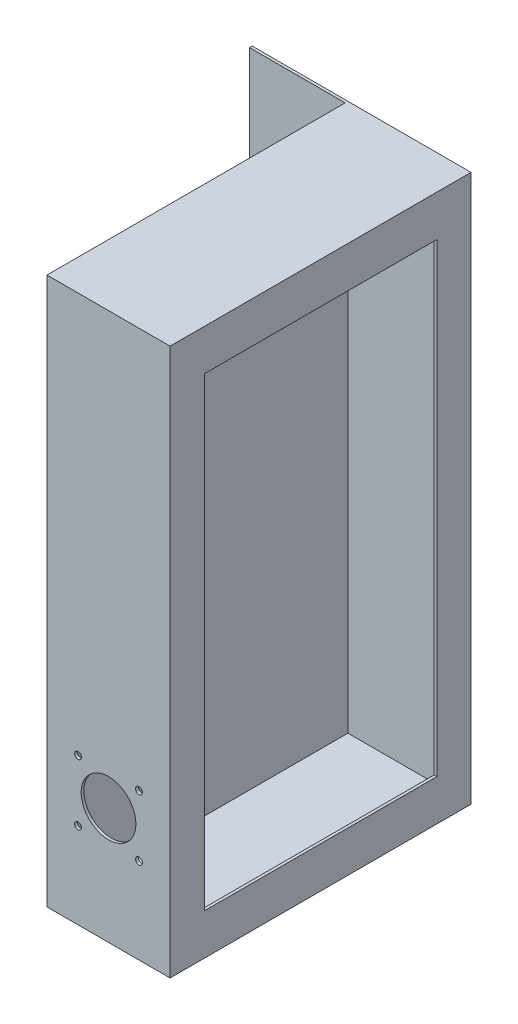
ISO-10303-21;
HEADER;
FILE_DESCRIPTION(('STEP AP214'),'2;1');
FILE_NAME('part.step','',(''),(''),'','','');
FILE_SCHEMA(('AUTOMOTIVE_DESIGN { 1 0 10303 214 1 1 1 1 }'));
ENDSEC;
DATA;
#1=APPLICATION_CONTEXT('core data for automotive mechanical design processes');
#2=APPLICATION_PROTOCOL_DEFINITION('international standard','automotive_design',2000,#1);
#3=PRODUCT_CONTEXT('',#1,'mechanical');
#4=PRODUCT('Part','Part','',(#3));
#5=PRODUCT_RELATED_PRODUCT_CATEGORY('part','',(#4));
#6=PRODUCT_DEFINITION_FORMATION('','',#4);
#7=PRODUCT_DEFINITION_CONTEXT('part definition',#1,'design');
#8=PRODUCT_DEFINITION('design','',#6,#7);
#9=PRODUCT_DEFINITION_SHAPE('','',#8);
#10=(LENGTH_UNIT() NAMED_UNIT(*) SI_UNIT(.MILLI.,.METRE.));
#11=(NAMED_UNIT(*) PLANE_ANGLE_UNIT() SI_UNIT($,.RADIAN.));
#12=(NAMED_UNIT(*) SI_UNIT($,.STERADIAN.) SOLID_ANGLE_UNIT());
#13=UNCERTAINTY_MEASURE_WITH_UNIT(LENGTH_MEASURE(1.E-05),#10,'distance_accuracy_value','');
#14=(GEOMETRIC_REPRESENTATION_CONTEXT(3) GLOBAL_UNCERTAINTY_ASSIGNED_CONTEXT((#13)) GLOBAL_UNIT_ASSIGNED_CONTEXT((#10,
#11,#12)) REPRESENTATION_CONTEXT('',''));
#15=CARTESIAN_POINT('',(0.,0.,0.));
#16=DIRECTION('',(0.,0.,1.));
#17=DIRECTION('',(1.,0.,0.));
#18=AXIS2_PLACEMENT_3D('',#15,#16,#17);
#19=CARTESIAN_POINT('',(45.,200.,110.));
#20=DIRECTION('',(-1.,0.,0.));
#21=DIRECTION('',(0.,-1.,0.));
#22=AXIS2_PLACEMENT_3D('',#19,#20,#21);
#23=PLANE('',#22);
#24=DIRECTION('',(0.,0.,1.));
#25=VECTOR('',#24,1.);
#26=CARTESIAN_POINT('',(45.,170.,85.));
#27=LINE('',#26,#25);
#28=CARTESIAN_POINT('',(45.,170.,-85.));
#29=VERTEX_POINT('',#28);
#30=CARTESIAN_POINT('',(45.,170.,85.));
#31=VERTEX_POINT('',#30);
#32=EDGE_CURVE('E232',#29,#31,#27,.T.);
#33=ORIENTED_EDGE('',*,*,#32,.F.);
#34=DIRECTION('',(0.,1.,0.));
#35=VECTOR('',#34,1.);
#36=CARTESIAN_POINT('',(45.,170.,-85.));
#37=LINE('',#36,#35);
#38=CARTESIAN_POINT('',(45.,-170.,-85.));
#39=VERTEX_POINT('',#38);
#40=EDGE_CURVE('E235',#39,#29,#37,.T.);
#41=ORIENTED_EDGE('',*,*,#40,.F.);
#42=DIRECTION('',(0.,0.,-1.));
#43=VECTOR('',#42,1.);
#44=CARTESIAN_POINT('',(45.,-170.,85.));
#45=LINE('',#44,#43);
#46=CARTESIAN_POINT('',(45.,-170.,85.));
#47=VERTEX_POINT('',#46);
#48=EDGE_CURVE('E223',#47,#39,#45,.T.);
#49=ORIENTED_EDGE('',*,*,#48,.F.);
#50=DIRECTION('',(0.,-1.,0.));
#51=VECTOR('',#50,1.);
#52=CARTESIAN_POINT('',(45.,170.,85.));
#53=LINE('',#52,#51);
#54=EDGE_CURVE('E228',#31,#47,#53,.T.);
#55=ORIENTED_EDGE('',*,*,#54,.F.);
#56=EDGE_LOOP('',(#33,#41,#49,#55));
#57=FACE_BOUND('',#56,.T.);
#58=DIRECTION('',(0.,1.,0.));
#59=VECTOR('',#58,1.);
#60=CARTESIAN_POINT('',(45.,200.,-110.));
#61=LINE('',#60,#59);
#62=CARTESIAN_POINT('',(45.,-200.,-110.));
#63=VERTEX_POINT('',#62);
#64=CARTESIAN_POINT('',(45.,200.,-110.));
#65=VERTEX_POINT('',#64);
#66=EDGE_CURVE('E227',#63,#65,#61,.T.);
#67=ORIENTED_EDGE('',*,*,#66,.T.);
#68=DIRECTION('',(0.,0.,-1.));
#69=VECTOR('',#68,1.);
#70=CARTESIAN_POINT('',(45.,200.,110.));
#71=LINE('',#70,#69);
#72=CARTESIAN_POINT('',(45.,200.,110.));
#73=VERTEX_POINT('',#72);
#74=EDGE_CURVE('E292',#73,#65,#71,.T.);
#75=ORIENTED_EDGE('',*,*,#74,.F.);
#76=DIRECTION('',(0.,1.,0.));
#77=VECTOR('',#76,1.);
#78=CARTESIAN_POINT('',(45.,200.,110.));
#79=LINE('',#78,#77);
#80=CARTESIAN_POINT('',(45.,-200.,110.));
#81=VERTEX_POINT('',#80);
#82=EDGE_CURVE('E260',#81,#73,#79,.T.);
#83=ORIENTED_EDGE('',*,*,#82,.F.);
#84=DIRECTION('',(0.,0.,-1.));
#85=VECTOR('',#84,1.);
#86=CARTESIAN_POINT('',(45.,-200.,110.));
#87=LINE('',#86,#85);
#88=EDGE_CURVE('E274',#81,#63,#87,.T.);
#89=ORIENTED_EDGE('',*,*,#88,.T.);
#90=EDGE_LOOP('',(#67,#75,#83,#89));
#91=FACE_BOUND('',#90,.T.);
#92=ADVANCED_FACE('F39',(#57,#91),#23,.F.);
#93=CARTESIAN_POINT('',(-45.,200.,110.));
#94=DIRECTION('',(0.,-1.,0.));
#95=DIRECTION('',(0.,0.,-1.));
#96=AXIS2_PLACEMENT_3D('',#93,#94,#95);
#97=PLANE('',#96);
#98=DIRECTION('',(-1.,0.,0.));
#99=VECTOR('',#98,1.);
#100=CARTESIAN_POINT('',(-45.,200.,-110.));
#101=LINE('',#100,#99);
#102=CARTESIAN_POINT('',(-115.,200.,-110.));
#103=VERTEX_POINT('',#102);
#104=EDGE_CURVE('E278',#65,#103,#101,.T.);
#105=ORIENTED_EDGE('',*,*,#104,.T.);
#106=DIRECTION('',(0.,0.,-1.));
#107=VECTOR('',#106,1.);
#108=CARTESIAN_POINT('',(-115.,200.,-108.));
#109=LINE('',#108,#107);
#110=CARTESIAN_POINT('',(-115.,200.,-108.));
#111=VERTEX_POINT('',#110);
#112=EDGE_CURVE('E153',#111,#103,#109,.T.);
#113=ORIENTED_EDGE('',*,*,#112,.F.);
#114=DIRECTION('',(1.,0.,0.));
#115=VECTOR('',#114,1.);
#116=CARTESIAN_POINT('',(-45.,200.,-108.));
#117=LINE('',#116,#115);
#118=CARTESIAN_POINT('',(-45.,200.,-108.));
#119=VERTEX_POINT('',#118);
#120=EDGE_CURVE('E154',#111,#119,#117,.T.);
#121=ORIENTED_EDGE('',*,*,#120,.T.);
#122=DIRECTION('',(0.,0.,-1.));
#123=VECTOR('',#122,1.);
#124=CARTESIAN_POINT('',(-45.,200.,110.));
#125=LINE('',#124,#123);
#126=CARTESIAN_POINT('',(-45.,200.,110.));
#127=VERTEX_POINT('',#126);
#128=EDGE_CURVE('E288',#127,#119,#125,.T.);
#129=ORIENTED_EDGE('',*,*,#128,.F.);
#130=DIRECTION('',(-1.,0.,0.));
#131=VECTOR('',#130,1.);
#132=CARTESIAN_POINT('',(-45.,200.,110.));
#133=LINE('',#132,#131);
#134=EDGE_CURVE('E264',#73,#127,#133,.T.);
#135=ORIENTED_EDGE('',*,*,#134,.F.);
#136=ORIENTED_EDGE('',*,*,#74,.T.);
#137=EDGE_LOOP('',(#105,#113,#121,#129,#135,#136));
#138=FACE_BOUND('',#137,.T.);
#139=ADVANCED_FACE('F361',(#138),#97,.F.);
#140=CARTESIAN_POINT('',(-45.,200.,110.));
#141=DIRECTION('',(1.,0.,0.));
#142=DIRECTION('',(0.,1.,0.));
#143=AXIS2_PLACEMENT_3D('',#140,#141,#142);
#144=PLANE('',#143);
#145=ORIENTED_EDGE('',*,*,#128,.T.);
#146=DIRECTION('',(0.,-1.,0.));
#147=VECTOR('',#146,1.);
#148=CARTESIAN_POINT('',(-45.,200.,-108.));
#149=LINE('',#148,#147);
#150=CARTESIAN_POINT('',(-45.,-200.,-108.));
#151=VERTEX_POINT('',#150);
#152=EDGE_CURVE('E166',#119,#151,#149,.T.);
#153=ORIENTED_EDGE('',*,*,#152,.T.);
#154=DIRECTION('',(0.,0.,-1.));
#155=VECTOR('',#154,1.);
#156=CARTESIAN_POINT('',(-45.,-200.,110.));
#157=LINE('',#156,#155);
#158=CARTESIAN_POINT('',(-45.,-200.,110.));
#159=VERTEX_POINT('',#158);
#160=EDGE_CURVE('E164',#159,#151,#157,.T.);
#161=ORIENTED_EDGE('',*,*,#160,.F.);
#162=DIRECTION('',(0.,-1.,0.));
#163=VECTOR('',#162,1.);
#164=CARTESIAN_POINT('',(-45.,200.,110.));
#165=LINE('',#164,#163);
#166=EDGE_CURVE('E268',#127,#159,#165,.T.);
#167=ORIENTED_EDGE('',*,*,#166,.F.);
#168=EDGE_LOOP('',(#145,#153,#161,#167));
#169=FACE_BOUND('',#168,.T.);
#170=ADVANCED_FACE('F368',(#169),#144,.F.);
#171=CARTESIAN_POINT('',(-45.,-200.,110.));
#172=DIRECTION('',(0.,1.,0.));
#173=DIRECTION('',(0.,0.,1.));
#174=AXIS2_PLACEMENT_3D('',#171,#172,#173);
#175=PLANE('',#174);
#176=DIRECTION('',(1.,0.,0.));
#177=VECTOR('',#176,1.);
#178=CARTESIAN_POINT('',(-45.,-200.,-110.));
#179=LINE('',#178,#177);
#180=CARTESIAN_POINT('',(-115.,-200.,-110.));
#181=VERTEX_POINT('',#180);
#182=EDGE_CURVE('E265',#181,#63,#179,.T.);
#183=ORIENTED_EDGE('',*,*,#182,.T.);
#184=ORIENTED_EDGE('',*,*,#88,.F.);
#185=DIRECTION('',(1.,0.,0.));
#186=VECTOR('',#185,1.);
#187=CARTESIAN_POINT('',(-45.,-200.,110.));
#188=LINE('',#187,#186);
#189=EDGE_CURVE('E271',#159,#81,#188,.T.);
#190=ORIENTED_EDGE('',*,*,#189,.F.);
#191=ORIENTED_EDGE('',*,*,#160,.T.);
#192=DIRECTION('',(-1.,0.,0.));
#193=VECTOR('',#192,1.);
#194=CARTESIAN_POINT('',(-45.0000000000001,-200.,-108.));
#195=LINE('',#194,#193);
#196=CARTESIAN_POINT('',(-115.,-200.,-108.));
#197=VERTEX_POINT('',#196);
#198=EDGE_CURVE('E57',#151,#197,#195,.T.);
#199=ORIENTED_EDGE('',*,*,#198,.T.);
#200=DIRECTION('',(0.,0.,-1.));
#201=VECTOR('',#200,1.);
#202=CARTESIAN_POINT('',(-115.,-200.,-108.));
#203=LINE('',#202,#201);
#204=EDGE_CURVE('E144',#197,#181,#203,.T.);
#205=ORIENTED_EDGE('',*,*,#204,.T.);
#206=EDGE_LOOP('',(#183,#184,#190,#191,#199,#205));
#207=FACE_BOUND('',#206,.T.);
#208=ADVANCED_FACE('F161',(#207),#175,.F.);
#209=CARTESIAN_POINT('',(0.,0.,110.));
#210=DIRECTION('',(0.,0.,1.));
#211=DIRECTION('',(1.,0.,0.));
#212=AXIS2_PLACEMENT_3D('',#209,#210,#211);
#213=PLANE('',#212);
#214=CARTESIAN_POINT('',(22.275,-137.275,110.));
#215=DIRECTION('',(0.,0.,1.));
#216=DIRECTION('',(1.,0.,0.));
#217=AXIS2_PLACEMENT_3D('',#214,#215,#216);
#218=CIRCLE('',#217,2.5);
#219=CARTESIAN_POINT('',(24.775,-137.275,110.));
#220=VERTEX_POINT('',#219);
#221=EDGE_CURVE('E176',#220,#220,#218,.T.);
#222=ORIENTED_EDGE('',*,*,#221,.F.);
#223=EDGE_LOOP('',(#222));
#224=FACE_BOUND('',#223,.T.);
#225=CARTESIAN_POINT('',(-22.275,-137.275,110.));
#226=DIRECTION('',(0.,0.,1.));
#227=DIRECTION('',(1.,0.,0.));
#228=AXIS2_PLACEMENT_3D('',#225,#226,#227);
#229=CIRCLE('',#228,2.5);
#230=CARTESIAN_POINT('',(-19.775,-137.275,110.));
#231=VERTEX_POINT('',#230);
#232=EDGE_CURVE('E196',#231,#231,#229,.T.);
#233=ORIENTED_EDGE('',*,*,#232,.F.);
#234=EDGE_LOOP('',(#233));
#235=FACE_BOUND('',#234,.T.);
#236=CARTESIAN_POINT('',(22.275,-92.725,110.));
#237=DIRECTION('',(0.,0.,1.));
#238=DIRECTION('',(1.,0.,0.));
#239=AXIS2_PLACEMENT_3D('',#236,#237,#238);
#240=CIRCLE('',#239,2.5);
#241=CARTESIAN_POINT('',(24.775,-92.725,110.));
#242=VERTEX_POINT('',#241);
#243=EDGE_CURVE('E188',#242,#242,#240,.T.);
#244=ORIENTED_EDGE('',*,*,#243,.F.);
#245=EDGE_LOOP('',(#244));
#246=FACE_BOUND('',#245,.T.);
#247=CARTESIAN_POINT('',(-22.275,-92.725,110.));
#248=DIRECTION('',(0.,0.,1.));
#249=DIRECTION('',(1.,0.,0.));
#250=AXIS2_PLACEMENT_3D('',#247,#248,#249);
#251=CIRCLE('',#250,2.5);
#252=CARTESIAN_POINT('',(-19.775,-92.725,110.));
#253=VERTEX_POINT('',#252);
#254=EDGE_CURVE('E178',#253,#253,#251,.T.);
#255=ORIENTED_EDGE('',*,*,#254,.F.);
#256=EDGE_LOOP('',(#255));
#257=FACE_BOUND('',#256,.T.);
#258=CARTESIAN_POINT('',(0.,-115.,110.));
#259=DIRECTION('',(0.,0.,1.));
#260=DIRECTION('',(1.,0.,0.));
#261=AXIS2_PLACEMENT_3D('',#258,#259,#260);
#262=CIRCLE('',#261,20.);
#263=CARTESIAN_POINT('',(20.,-115.,110.));
#264=VERTEX_POINT('',#263);
#265=EDGE_CURVE('E187',#264,#264,#262,.T.);
#266=ORIENTED_EDGE('',*,*,#265,.F.);
#267=EDGE_LOOP('',(#266));
#268=FACE_BOUND('',#267,.T.);
#269=ORIENTED_EDGE('',*,*,#82,.T.);
#270=ORIENTED_EDGE('',*,*,#134,.T.);
#271=ORIENTED_EDGE('',*,*,#166,.T.);
#272=ORIENTED_EDGE('',*,*,#189,.T.);
#273=EDGE_LOOP('',(#269,#270,#271,#272));
#274=FACE_BOUND('',#273,.T.);
#275=ADVANCED_FACE('F456',(#224,#235,#246,#257,#268,#274),#213,.T.);
#276=CARTESIAN_POINT('',(0.,0.,-110.));
#277=DIRECTION('',(0.,0.,1.));
#278=DIRECTION('',(1.,0.,0.));
#279=AXIS2_PLACEMENT_3D('',#276,#277,#278);
#280=PLANE('',#279);
#281=ORIENTED_EDGE('',*,*,#66,.F.);
#282=ORIENTED_EDGE('',*,*,#182,.F.);
#283=DIRECTION('',(0.,1.,0.));
#284=VECTOR('',#283,1.);
#285=CARTESIAN_POINT('',(-115.,200.,-110.));
#286=LINE('',#285,#284);
#287=EDGE_CURVE('E150',#181,#103,#286,.T.);
#288=ORIENTED_EDGE('',*,*,#287,.T.);
#289=ORIENTED_EDGE('',*,*,#104,.F.);
#290=EDGE_LOOP('',(#281,#282,#288,#289));
#291=FACE_BOUND('',#290,.T.);
#292=ADVANCED_FACE('F419',(#291),#280,.F.);
#293=CARTESIAN_POINT('',(-45.0010000000001,170.,-85.));
#294=DIRECTION('',(0.,0.,-1.));
#295=DIRECTION('',(0.,1.,0.));
#296=AXIS2_PLACEMENT_3D('',#293,#294,#295);
#297=PLANE('',#296);
#298=DIRECTION('',(1.,0.,0.));
#299=VECTOR('',#298,1.);
#300=CARTESIAN_POINT('',(-45.001,-170.,-85.));
#301=LINE('',#300,#299);
#302=CARTESIAN_POINT('',(43.,-170.,-85.));
#303=VERTEX_POINT('',#302);
#304=EDGE_CURVE('E246',#303,#39,#301,.T.);
#305=ORIENTED_EDGE('',*,*,#304,.T.);
#306=ORIENTED_EDGE('',*,*,#40,.T.);
#307=DIRECTION('',(1.,0.,0.));
#308=VECTOR('',#307,1.);
#309=CARTESIAN_POINT('',(-45.0010000000001,170.,-85.));
#310=LINE('',#309,#308);
#311=CARTESIAN_POINT('',(43.,170.,-85.));
#312=VERTEX_POINT('',#311);
#313=EDGE_CURVE('E241',#312,#29,#310,.T.);
#314=ORIENTED_EDGE('',*,*,#313,.F.);
#315=DIRECTION('',(0.,1.,0.));
#316=VECTOR('',#315,1.);
#317=CARTESIAN_POINT('',(43.,170.,-85.));
#318=LINE('',#317,#316);
#319=EDGE_CURVE('E217',#303,#312,#318,.T.);
#320=ORIENTED_EDGE('',*,*,#319,.F.);
#321=EDGE_LOOP('',(#305,#306,#314,#320));
#322=FACE_BOUND('',#321,.T.);
#323=ADVANCED_FACE('F413',(#322),#297,.F.);
#324=CARTESIAN_POINT('',(-45.001,-170.,85.));
#325=DIRECTION('',(0.,-1.,0.));
#326=DIRECTION('',(1.,0.,0.));
#327=AXIS2_PLACEMENT_3D('',#324,#325,#326);
#328=PLANE('',#327);
#329=DIRECTION('',(1.,0.,0.));
#330=VECTOR('',#329,1.);
#331=CARTESIAN_POINT('',(-45.001,-170.,85.));
#332=LINE('',#331,#330);
#333=CARTESIAN_POINT('',(43.,-170.,85.));
#334=VERTEX_POINT('',#333);
#335=EDGE_CURVE('E222',#334,#47,#332,.T.);
#336=ORIENTED_EDGE('',*,*,#335,.T.);
#337=ORIENTED_EDGE('',*,*,#48,.T.);
#338=ORIENTED_EDGE('',*,*,#304,.F.);
#339=DIRECTION('',(0.,0.,-1.));
#340=VECTOR('',#339,1.);
#341=CARTESIAN_POINT('',(43.,-170.,85.));
#342=LINE('',#341,#340);
#343=EDGE_CURVE('E242',#334,#303,#342,.T.);
#344=ORIENTED_EDGE('',*,*,#343,.F.);
#345=EDGE_LOOP('',(#336,#337,#338,#344));
#346=FACE_BOUND('',#345,.T.);
#347=ADVANCED_FACE('F418',(#346),#328,.F.);
#348=CARTESIAN_POINT('',(-45.0010000000001,170.,85.));
#349=DIRECTION('',(0.,0.,1.));
#350=DIRECTION('',(0.,-1.,0.));
#351=AXIS2_PLACEMENT_3D('',#348,#349,#350);
#352=PLANE('',#351);
#353=DIRECTION('',(1.,0.,0.));
#354=VECTOR('',#353,1.);
#355=CARTESIAN_POINT('',(-45.0010000000001,170.,85.));
#356=LINE('',#355,#354);
#357=CARTESIAN_POINT('',(43.,170.,85.));
#358=VERTEX_POINT('',#357);
#359=EDGE_CURVE('E65',#358,#31,#356,.T.);
#360=ORIENTED_EDGE('',*,*,#359,.T.);
#361=ORIENTED_EDGE('',*,*,#54,.T.);
#362=ORIENTED_EDGE('',*,*,#335,.F.);
#363=DIRECTION('',(0.,-1.,0.));
#364=VECTOR('',#363,1.);
#365=CARTESIAN_POINT('',(43.,170.,85.));
#366=LINE('',#365,#364);
#367=EDGE_CURVE('E247',#358,#334,#366,.T.);
#368=ORIENTED_EDGE('',*,*,#367,.F.);
#369=EDGE_LOOP('',(#360,#361,#362,#368));
#370=FACE_BOUND('',#369,.T.);
#371=ADVANCED_FACE('F430',(#370),#352,.F.);
#372=CARTESIAN_POINT('',(-45.0010000000001,170.,85.));
#373=DIRECTION('',(0.,1.,0.));
#374=DIRECTION('',(-1.,0.,0.));
#375=AXIS2_PLACEMENT_3D('',#372,#373,#374);
#376=PLANE('',#375);
#377=ORIENTED_EDGE('',*,*,#313,.T.);
#378=ORIENTED_EDGE('',*,*,#32,.T.);
#379=ORIENTED_EDGE('',*,*,#359,.F.);
#380=DIRECTION('',(0.,0.,1.));
#381=VECTOR('',#380,1.);
#382=CARTESIAN_POINT('',(43.,170.,85.));
#383=LINE('',#382,#381);
#384=EDGE_CURVE('E218',#312,#358,#383,.T.);
#385=ORIENTED_EDGE('',*,*,#384,.F.);
#386=EDGE_LOOP('',(#377,#378,#379,#385));
#387=FACE_BOUND('',#386,.T.);
#388=ADVANCED_FACE('F377',(#387),#376,.F.);
#389=CARTESIAN_POINT('',(43.,200.,110.));
#390=DIRECTION('',(-1.,0.,0.));
#391=DIRECTION('',(0.,-1.,0.));
#392=AXIS2_PLACEMENT_3D('',#389,#390,#391);
#393=PLANE('',#392);
#394=DIRECTION('',(0.,1.,0.));
#395=VECTOR('',#394,1.);
#396=CARTESIAN_POINT('',(43.,200.,-108.));
#397=LINE('',#396,#395);
#398=CARTESIAN_POINT('',(43.,-198.,-108.));
#399=VERTEX_POINT('',#398);
#400=CARTESIAN_POINT('',(43.,198.,-108.));
#401=VERTEX_POINT('',#400);
#402=EDGE_CURVE('E43',#399,#401,#397,.T.);
#403=ORIENTED_EDGE('',*,*,#402,.F.);
#404=DIRECTION('',(0.,0.,-1.));
#405=VECTOR('',#404,1.);
#406=CARTESIAN_POINT('',(43.,-198.,110.));
#407=LINE('',#406,#405);
#408=CARTESIAN_POINT('',(43.,-198.,108.));
#409=VERTEX_POINT('',#408);
#410=EDGE_CURVE('E325',#409,#399,#407,.T.);
#411=ORIENTED_EDGE('',*,*,#410,.F.);
#412=DIRECTION('',(0.,1.,0.));
#413=VECTOR('',#412,1.);
#414=CARTESIAN_POINT('',(43.,200.,108.));
#415=LINE('',#414,#413);
#416=CARTESIAN_POINT('',(43.,198.,108.));
#417=VERTEX_POINT('',#416);
#418=EDGE_CURVE('E301',#409,#417,#415,.T.);
#419=ORIENTED_EDGE('',*,*,#418,.T.);
#420=DIRECTION('',(0.,0.,-1.));
#421=VECTOR('',#420,1.);
#422=CARTESIAN_POINT('',(43.,198.,110.));
#423=LINE('',#422,#421);
#424=EDGE_CURVE('E319',#417,#401,#423,.T.);
#425=ORIENTED_EDGE('',*,*,#424,.T.);
#426=EDGE_LOOP('',(#403,#411,#419,#425));
#427=FACE_BOUND('',#426,.T.);
#428=ORIENTED_EDGE('',*,*,#343,.T.);
#429=ORIENTED_EDGE('',*,*,#319,.T.);
#430=ORIENTED_EDGE('',*,*,#384,.T.);
#431=ORIENTED_EDGE('',*,*,#367,.T.);
#432=EDGE_LOOP('',(#428,#429,#430,#431));
#433=FACE_BOUND('',#432,.T.);
#434=ADVANCED_FACE('F336',(#427,#433),#393,.T.);
#435=CARTESIAN_POINT('',(-45.,198.,110.));
#436=DIRECTION('',(0.,-1.,0.));
#437=DIRECTION('',(0.,0.,-1.));
#438=AXIS2_PLACEMENT_3D('',#435,#436,#437);
#439=PLANE('',#438);
#440=DIRECTION('',(-1.,0.,0.));
#441=VECTOR('',#440,1.);
#442=CARTESIAN_POINT('',(-45.,198.,-108.));
#443=LINE('',#442,#441);
#444=CARTESIAN_POINT('',(-43.,198.,-108.));
#445=VERTEX_POINT('',#444);
#446=EDGE_CURVE('E323',#401,#445,#443,.T.);
#447=ORIENTED_EDGE('',*,*,#446,.F.);
#448=ORIENTED_EDGE('',*,*,#424,.F.);
#449=DIRECTION('',(-1.,0.,0.));
#450=VECTOR('',#449,1.);
#451=CARTESIAN_POINT('',(-45.,198.,108.));
#452=LINE('',#451,#450);
#453=CARTESIAN_POINT('',(-43.,198.,108.));
#454=VERTEX_POINT('',#453);
#455=EDGE_CURVE('E298',#417,#454,#452,.T.);
#456=ORIENTED_EDGE('',*,*,#455,.T.);
#457=DIRECTION('',(0.,0.,-1.));
#458=VECTOR('',#457,1.);
#459=CARTESIAN_POINT('',(-43.,198.,110.));
#460=LINE('',#459,#458);
#461=EDGE_CURVE('E312',#454,#445,#460,.T.);
#462=ORIENTED_EDGE('',*,*,#461,.T.);
#463=EDGE_LOOP('',(#447,#448,#456,#462));
#464=FACE_BOUND('',#463,.T.);
#465=ADVANCED_FACE('F341',(#464),#439,.T.);
#466=CARTESIAN_POINT('',(-43.,200.,110.));
#467=DIRECTION('',(1.,0.,0.));
#468=DIRECTION('',(0.,1.,0.));
#469=AXIS2_PLACEMENT_3D('',#466,#467,#468);
#470=PLANE('',#469);
#471=DIRECTION('',(0.,-1.,0.));
#472=VECTOR('',#471,1.);
#473=CARTESIAN_POINT('',(-43.,200.,-108.));
#474=LINE('',#473,#472);
#475=CARTESIAN_POINT('',(-43.,-198.,-108.));
#476=VERTEX_POINT('',#475);
#477=EDGE_CURVE('E316',#445,#476,#474,.T.);
#478=ORIENTED_EDGE('',*,*,#477,.F.);
#479=ORIENTED_EDGE('',*,*,#461,.F.);
#480=DIRECTION('',(0.,-1.,0.));
#481=VECTOR('',#480,1.);
#482=CARTESIAN_POINT('',(-43.,200.,108.));
#483=LINE('',#482,#481);
#484=CARTESIAN_POINT('',(-43.,-198.,108.));
#485=VERTEX_POINT('',#484);
#486=EDGE_CURVE('E49',#454,#485,#483,.T.);
#487=ORIENTED_EDGE('',*,*,#486,.T.);
#488=DIRECTION('',(0.,0.,-1.));
#489=VECTOR('',#488,1.);
#490=CARTESIAN_POINT('',(-43.,-198.,110.));
#491=LINE('',#490,#489);
#492=EDGE_CURVE('E305',#485,#476,#491,.T.);
#493=ORIENTED_EDGE('',*,*,#492,.T.);
#494=EDGE_LOOP('',(#478,#479,#487,#493));
#495=FACE_BOUND('',#494,.T.);
#496=ADVANCED_FACE('F346',(#495),#470,.T.);
#497=CARTESIAN_POINT('',(-45.,-198.,110.));
#498=DIRECTION('',(0.,1.,0.));
#499=DIRECTION('',(0.,0.,1.));
#500=AXIS2_PLACEMENT_3D('',#497,#498,#499);
#501=PLANE('',#500);
#502=DIRECTION('',(1.,0.,0.));
#503=VECTOR('',#502,1.);
#504=CARTESIAN_POINT('',(-45.,-198.,-108.));
#505=LINE('',#504,#503);
#506=EDGE_CURVE('E309',#476,#399,#505,.T.);
#507=ORIENTED_EDGE('',*,*,#506,.F.);
#508=ORIENTED_EDGE('',*,*,#492,.F.);
#509=DIRECTION('',(1.,0.,0.));
#510=VECTOR('',#509,1.);
#511=CARTESIAN_POINT('',(-45.,-198.,108.));
#512=LINE('',#511,#510);
#513=EDGE_CURVE('E11',#485,#409,#512,.T.);
#514=ORIENTED_EDGE('',*,*,#513,.T.);
#515=ORIENTED_EDGE('',*,*,#410,.T.);
#516=EDGE_LOOP('',(#507,#508,#514,#515));
#517=FACE_BOUND('',#516,.T.);
#518=ADVANCED_FACE('F349',(#517),#501,.T.);
#519=CARTESIAN_POINT('',(0.,0.,108.));
#520=DIRECTION('',(0.,0.,1.));
#521=DIRECTION('',(1.,0.,0.));
#522=AXIS2_PLACEMENT_3D('',#519,#520,#521);
#523=PLANE('',#522);
#524=CARTESIAN_POINT('',(22.275,-137.275,108.));
#525=DIRECTION('',(0.,0.,1.));
#526=DIRECTION('',(1.,0.,0.));
#527=AXIS2_PLACEMENT_3D('',#524,#525,#526);
#528=CIRCLE('',#527,2.5);
#529=CARTESIAN_POINT('',(24.775,-137.275,108.));
#530=VERTEX_POINT('',#529);
#531=EDGE_CURVE('E200',#530,#530,#528,.F.);
#532=ORIENTED_EDGE('',*,*,#531,.F.);
#533=EDGE_LOOP('',(#532));
#534=FACE_BOUND('',#533,.T.);
#535=CARTESIAN_POINT('',(-22.275,-137.275,108.));
#536=DIRECTION('',(0.,0.,1.));
#537=DIRECTION('',(1.,0.,0.));
#538=AXIS2_PLACEMENT_3D('',#535,#536,#537);
#539=CIRCLE('',#538,2.5);
#540=CARTESIAN_POINT('',(-19.775,-137.275,108.));
#541=VERTEX_POINT('',#540);
#542=EDGE_CURVE('E192',#541,#541,#539,.F.);
#543=ORIENTED_EDGE('',*,*,#542,.F.);
#544=EDGE_LOOP('',(#543));
#545=FACE_BOUND('',#544,.T.);
#546=CARTESIAN_POINT('',(22.275,-92.725,108.));
#547=DIRECTION('',(0.,0.,1.));
#548=DIRECTION('',(1.,0.,0.));
#549=AXIS2_PLACEMENT_3D('',#546,#547,#548);
#550=CIRCLE('',#549,2.5);
#551=CARTESIAN_POINT('',(24.775,-92.725,108.));
#552=VERTEX_POINT('',#551);
#553=EDGE_CURVE('E183',#552,#552,#550,.F.);
#554=ORIENTED_EDGE('',*,*,#553,.F.);
#555=EDGE_LOOP('',(#554));
#556=FACE_BOUND('',#555,.T.);
#557=CARTESIAN_POINT('',(-22.275,-92.725,108.));
#558=DIRECTION('',(0.,0.,1.));
#559=DIRECTION('',(1.,0.,0.));
#560=AXIS2_PLACEMENT_3D('',#557,#558,#559);
#561=CIRCLE('',#560,2.5);
#562=CARTESIAN_POINT('',(-19.775,-92.725,108.));
#563=VERTEX_POINT('',#562);
#564=EDGE_CURVE('E182',#563,#563,#561,.F.);
#565=ORIENTED_EDGE('',*,*,#564,.F.);
#566=EDGE_LOOP('',(#565));
#567=FACE_BOUND('',#566,.T.);
#568=CARTESIAN_POINT('',(0.,-115.,108.));
#569=DIRECTION('',(0.,0.,1.));
#570=DIRECTION('',(1.,0.,0.));
#571=AXIS2_PLACEMENT_3D('',#568,#569,#570);
#572=CIRCLE('',#571,20.);
#573=CARTESIAN_POINT('',(20.,-115.,108.));
#574=VERTEX_POINT('',#573);
#575=EDGE_CURVE('E213',#574,#574,#572,.F.);
#576=ORIENTED_EDGE('',*,*,#575,.F.);
#577=EDGE_LOOP('',(#576));
#578=FACE_BOUND('',#577,.T.);
#579=ORIENTED_EDGE('',*,*,#418,.F.);
#580=ORIENTED_EDGE('',*,*,#513,.F.);
#581=ORIENTED_EDGE('',*,*,#486,.F.);
#582=ORIENTED_EDGE('',*,*,#455,.F.);
#583=EDGE_LOOP('',(#579,#580,#581,#582));
#584=FACE_BOUND('',#583,.T.);
#585=ADVANCED_FACE('F351',(#534,#545,#556,#567,#578,#584),#523,.F.);
#586=CARTESIAN_POINT('',(0.,0.,-108.));
#587=DIRECTION('',(0.,0.,1.));
#588=DIRECTION('',(1.,0.,0.));
#589=AXIS2_PLACEMENT_3D('',#586,#587,#588);
#590=PLANE('',#589);
#591=ORIENTED_EDGE('',*,*,#402,.T.);
#592=ORIENTED_EDGE('',*,*,#446,.T.);
#593=ORIENTED_EDGE('',*,*,#477,.T.);
#594=ORIENTED_EDGE('',*,*,#506,.T.);
#595=EDGE_LOOP('',(#591,#592,#593,#594));
#596=FACE_BOUND('',#595,.T.);
#597=ADVANCED_FACE('F41',(#596),#590,.T.);
#598=CARTESIAN_POINT('',(0.,-115.,-110.001));
#599=DIRECTION('',(0.,0.,1.));
#600=DIRECTION('',(1.,0.,0.));
#601=AXIS2_PLACEMENT_3D('',#598,#599,#600);
#602=CYLINDRICAL_SURFACE('',#601,20.);
#603=ORIENTED_EDGE('',*,*,#265,.T.);
#604=EDGE_LOOP('',(#603));
#605=FACE_BOUND('',#604,.T.);
#606=ORIENTED_EDGE('',*,*,#575,.T.);
#607=EDGE_LOOP('',(#606));
#608=FACE_BOUND('',#607,.T.);
#609=ADVANCED_FACE('F401',(#605,#608),#602,.F.);
#610=CARTESIAN_POINT('',(-22.275,-92.725,-110.001));
#611=DIRECTION('',(0.,0.,1.));
#612=DIRECTION('',(1.,0.,0.));
#613=AXIS2_PLACEMENT_3D('',#610,#611,#612);
#614=CYLINDRICAL_SURFACE('',#613,2.5);
#615=ORIENTED_EDGE('',*,*,#254,.T.);
#616=EDGE_LOOP('',(#615));
#617=FACE_BOUND('',#616,.T.);
#618=ORIENTED_EDGE('',*,*,#564,.T.);
#619=EDGE_LOOP('',(#618));
#620=FACE_BOUND('',#619,.T.);
#621=ADVANCED_FACE('F467',(#617,#620),#614,.F.);
#622=CARTESIAN_POINT('',(22.275,-92.725,-110.001));
#623=DIRECTION('',(0.,0.,1.));
#624=DIRECTION('',(1.,0.,0.));
#625=AXIS2_PLACEMENT_3D('',#622,#623,#624);
#626=CYLINDRICAL_SURFACE('',#625,2.5);
#627=ORIENTED_EDGE('',*,*,#243,.T.);
#628=EDGE_LOOP('',(#627));
#629=FACE_BOUND('',#628,.T.);
#630=ORIENTED_EDGE('',*,*,#553,.T.);
#631=EDGE_LOOP('',(#630));
#632=FACE_BOUND('',#631,.T.);
#633=ADVANCED_FACE('F477',(#629,#632),#626,.F.);
#634=CARTESIAN_POINT('',(-22.275,-137.275,-110.001));
#635=DIRECTION('',(0.,0.,1.));
#636=DIRECTION('',(1.,0.,0.));
#637=AXIS2_PLACEMENT_3D('',#634,#635,#636);
#638=CYLINDRICAL_SURFACE('',#637,2.5);
#639=ORIENTED_EDGE('',*,*,#232,.T.);
#640=EDGE_LOOP('',(#639));
#641=FACE_BOUND('',#640,.T.);
#642=ORIENTED_EDGE('',*,*,#542,.T.);
#643=EDGE_LOOP('',(#642));
#644=FACE_BOUND('',#643,.T.);
#645=ADVANCED_FACE('F487',(#641,#644),#638,.F.);
#646=CARTESIAN_POINT('',(22.275,-137.275,-110.001));
#647=DIRECTION('',(0.,0.,1.));
#648=DIRECTION('',(1.,0.,0.));
#649=AXIS2_PLACEMENT_3D('',#646,#647,#648);
#650=CYLINDRICAL_SURFACE('',#649,2.5);
#651=ORIENTED_EDGE('',*,*,#221,.T.);
#652=EDGE_LOOP('',(#651));
#653=FACE_BOUND('',#652,.T.);
#654=ORIENTED_EDGE('',*,*,#531,.T.);
#655=EDGE_LOOP('',(#654));
#656=FACE_BOUND('',#655,.T.);
#657=ADVANCED_FACE('F497',(#653,#656),#650,.F.);
#658=CARTESIAN_POINT('',(-115.,200.,-108.));
#659=DIRECTION('',(-1.,0.,0.));
#660=DIRECTION('',(0.,-1.,0.));
#661=AXIS2_PLACEMENT_3D('',#658,#659,#660);
#662=PLANE('',#661);
#663=ORIENTED_EDGE('',*,*,#287,.F.);
#664=ORIENTED_EDGE('',*,*,#204,.F.);
#665=DIRECTION('',(0.,1.,0.));
#666=VECTOR('',#665,1.);
#667=CARTESIAN_POINT('',(-115.,200.,-108.));
#668=LINE('',#667,#666);
#669=EDGE_CURVE('E147',#197,#111,#668,.T.);
#670=ORIENTED_EDGE('',*,*,#669,.T.);
#671=ORIENTED_EDGE('',*,*,#112,.T.);
#672=EDGE_LOOP('',(#663,#664,#670,#671));
#673=FACE_BOUND('',#672,.T.);
#674=ADVANCED_FACE('F145',(#673),#662,.T.);
#675=CARTESIAN_POINT('',(0.,0.,-108.));
#676=DIRECTION('',(0.,0.,-1.));
#677=DIRECTION('',(-1.,0.,0.));
#678=AXIS2_PLACEMENT_3D('',#675,#676,#677);
#679=PLANE('',#678);
#680=ORIENTED_EDGE('',*,*,#152,.F.);
#681=ORIENTED_EDGE('',*,*,#120,.F.);
#682=ORIENTED_EDGE('',*,*,#669,.F.);
#683=ORIENTED_EDGE('',*,*,#198,.F.);
#684=EDGE_LOOP('',(#680,#681,#682,#683));
#685=FACE_BOUND('',#684,.T.);
#686=ADVANCED_FACE('F156',(#685),#679,.F.);
#687=CLOSED_SHELL('',(#92,#139,#170,#208,#275,#292,#323,#347,#371,#388,#434,#465,#496,#518,#585,
#597,#609,#621,#633,#645,#657,#674,#686));
#688=MANIFOLD_SOLID_BREP('B2',#687);
#689=ADVANCED_BREP_SHAPE_REPRESENTATION('',(#18,#688),#14);
#690=SHAPE_DEFINITION_REPRESENTATION(#9,#689);
ENDSEC;
END-ISO-10303-21;
